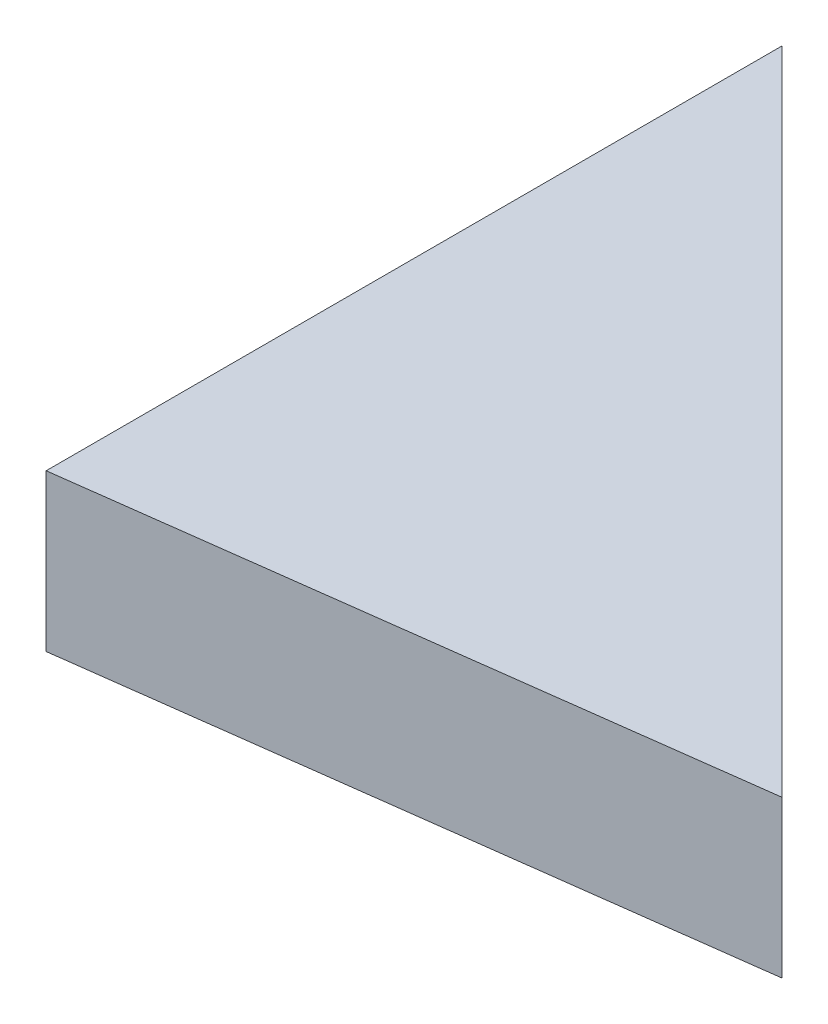
ISO-10303-21;
HEADER;
FILE_DESCRIPTION(('STEP AP214'),'2;1');
FILE_NAME('part.step','',(''),(''),'','','');
FILE_SCHEMA(('AUTOMOTIVE_DESIGN { 1 0 10303 214 1 1 1 1 }'));
ENDSEC;
DATA;
#1=APPLICATION_CONTEXT('core data for automotive mechanical design processes');
#2=APPLICATION_PROTOCOL_DEFINITION('international standard','automotive_design',2000,#1);
#3=PRODUCT_CONTEXT('',#1,'mechanical');
#4=PRODUCT('Part','Part','',(#3));
#5=PRODUCT_RELATED_PRODUCT_CATEGORY('part','',(#4));
#6=PRODUCT_DEFINITION_FORMATION('','',#4);
#7=PRODUCT_DEFINITION_CONTEXT('part definition',#1,'design');
#8=PRODUCT_DEFINITION('design','',#6,#7);
#9=PRODUCT_DEFINITION_SHAPE('','',#8);
#10=(LENGTH_UNIT() NAMED_UNIT(*) SI_UNIT(.MILLI.,.METRE.));
#11=(NAMED_UNIT(*) PLANE_ANGLE_UNIT() SI_UNIT($,.RADIAN.));
#12=(NAMED_UNIT(*) SI_UNIT($,.STERADIAN.) SOLID_ANGLE_UNIT());
#13=UNCERTAINTY_MEASURE_WITH_UNIT(LENGTH_MEASURE(1.E-05),#10,'distance_accuracy_value','');
#14=(GEOMETRIC_REPRESENTATION_CONTEXT(3) GLOBAL_UNCERTAINTY_ASSIGNED_CONTEXT((#13)) GLOBAL_UNIT_ASSIGNED_CONTEXT((#10,
#11,#12)) REPRESENTATION_CONTEXT('',''));
#15=CARTESIAN_POINT('',(0.,0.,0.));
#16=DIRECTION('',(0.,0.,1.));
#17=DIRECTION('',(1.,0.,0.));
#18=AXIS2_PLACEMENT_3D('',#15,#16,#17);
#19=CARTESIAN_POINT('',(52.4037824178887,3.175,0.));
#20=DIRECTION('',(1.,0.,0.));
#21=DIRECTION('',(0.,0.,-1.));
#22=AXIS2_PLACEMENT_3D('',#19,#20,#21);
#23=PLANE('',#22);
#24=DIRECTION('',(0.,0.,1.));
#25=VECTOR('',#24,1.);
#26=CARTESIAN_POINT('',(52.4037824178887,0.,0.));
#27=LINE('',#26,#25);
#28=CARTESIAN_POINT('',(52.4037824178887,0.,8.65426026672683));
#29=VERTEX_POINT('',#28);
#30=CARTESIAN_POINT('',(52.4037824178887,0.,23.5711999527268));
#31=VERTEX_POINT('',#30);
#32=EDGE_CURVE('E96',#29,#31,#27,.T.);
#33=ORIENTED_EDGE('',*,*,#32,.T.);
#34=DIRECTION('',(0.,-1.,0.));
#35=VECTOR('',#34,1.);
#36=CARTESIAN_POINT('',(52.4037824178887,3.175,23.5711999527268));
#37=LINE('',#36,#35);
#38=CARTESIAN_POINT('',(52.4037824178887,3.175,23.5711999527268));
#39=VERTEX_POINT('',#38);
#40=EDGE_CURVE('E11',#39,#31,#37,.T.);
#41=ORIENTED_EDGE('',*,*,#40,.F.);
#42=DIRECTION('',(0.,0.,1.));
#43=VECTOR('',#42,1.);
#44=CARTESIAN_POINT('',(52.4037824178887,3.175,0.));
#45=LINE('',#44,#43);
#46=CARTESIAN_POINT('',(52.4037824178887,3.175,8.65426026672683));
#47=VERTEX_POINT('',#46);
#48=EDGE_CURVE('E90',#47,#39,#45,.T.);
#49=ORIENTED_EDGE('',*,*,#48,.F.);
#50=DIRECTION('',(0.,-1.,0.));
#51=VECTOR('',#50,1.);
#52=CARTESIAN_POINT('',(52.4037824178887,3.175,8.65426026672683));
#53=LINE('',#52,#51);
#54=EDGE_CURVE('E64',#47,#29,#53,.T.);
#55=ORIENTED_EDGE('',*,*,#54,.T.);
#56=EDGE_LOOP('',(#33,#41,#49,#55));
#57=FACE_BOUND('',#56,.T.);
#58=ADVANCED_FACE('F47',(#57),#23,.F.);
#59=CARTESIAN_POINT('',(3.91463859582438,3.175,29.9161774819805));
#60=DIRECTION('',(-0.129747473069321,0.,-0.991547070608413));
#61=DIRECTION('',(-0.991547070608413,0.,0.129747473069321));
#62=AXIS2_PLACEMENT_3D('',#59,#60,#61);
#63=PLANE('',#62);
#64=DIRECTION('',(0.991547070608413,0.,-0.129747473069321));
#65=VECTOR('',#64,1.);
#66=CARTESIAN_POINT('',(3.91463859582438,0.,29.9161774819805));
#67=LINE('',#66,#65);
#68=CARTESIAN_POINT('',(65.5946500016934,0.,21.8451278505315));
#69=VERTEX_POINT('',#68);
#70=EDGE_CURVE('E100',#31,#69,#67,.T.);
#71=ORIENTED_EDGE('',*,*,#70,.T.);
#72=DIRECTION('',(0.,-1.,0.));
#73=VECTOR('',#72,1.);
#74=CARTESIAN_POINT('',(65.5946500016934,3.175,21.8451278505315));
#75=LINE('',#74,#73);
#76=CARTESIAN_POINT('',(65.5946500016934,3.175,21.8451278505315));
#77=VERTEX_POINT('',#76);
#78=EDGE_CURVE('E56',#77,#69,#75,.T.);
#79=ORIENTED_EDGE('',*,*,#78,.F.);
#80=DIRECTION('',(0.991547070608413,0.,-0.129747473069321));
#81=VECTOR('',#80,1.);
#82=CARTESIAN_POINT('',(3.91463859582438,3.175,29.9161774819805));
#83=LINE('',#82,#81);
#84=EDGE_CURVE('E82',#39,#77,#83,.T.);
#85=ORIENTED_EDGE('',*,*,#84,.F.);
#86=ORIENTED_EDGE('',*,*,#40,.T.);
#87=EDGE_LOOP('',(#71,#79,#85,#86));
#88=FACE_BOUND('',#87,.T.);
#89=ADVANCED_FACE('F84',(#88),#63,.F.);
#90=CARTESIAN_POINT('',(21.8747610755808,3.175,-21.8747610755809));
#91=DIRECTION('',(0.707106781186546,0.,-0.707106781186549));
#92=DIRECTION('',(-0.707106781186549,0.,-0.707106781186546));
#93=AXIS2_PLACEMENT_3D('',#90,#91,#92);
#94=PLANE('',#93);
#95=DIRECTION('',(0.707106781186549,0.,0.707106781186546));
#96=VECTOR('',#95,1.);
#97=CARTESIAN_POINT('',(21.8747610755808,0.,-21.8747610755809));
#98=LINE('',#97,#96);
#99=EDGE_CURVE('E94',#29,#69,#98,.T.);
#100=ORIENTED_EDGE('',*,*,#99,.F.);
#101=ORIENTED_EDGE('',*,*,#54,.F.);
#102=DIRECTION('',(0.707106781186549,0.,0.707106781186546));
#103=VECTOR('',#102,1.);
#104=CARTESIAN_POINT('',(21.8747610755808,3.175,-21.8747610755809));
#105=LINE('',#104,#103);
#106=EDGE_CURVE('E89',#47,#77,#105,.T.);
#107=ORIENTED_EDGE('',*,*,#106,.T.);
#108=ORIENTED_EDGE('',*,*,#78,.T.);
#109=EDGE_LOOP('',(#100,#101,#107,#108));
#110=FACE_BOUND('',#109,.T.);
#111=ADVANCED_FACE('F111',(#110),#94,.T.);
#112=CARTESIAN_POINT('',(0.,3.175,0.));
#113=DIRECTION('',(0.,1.,0.));
#114=DIRECTION('',(0.,0.,1.));
#115=AXIS2_PLACEMENT_3D('',#112,#113,#114);
#116=PLANE('',#115);
#117=ORIENTED_EDGE('',*,*,#48,.T.);
#118=ORIENTED_EDGE('',*,*,#84,.T.);
#119=ORIENTED_EDGE('',*,*,#106,.F.);
#120=EDGE_LOOP('',(#117,#118,#119));
#121=FACE_BOUND('',#120,.T.);
#122=ADVANCED_FACE('F92',(#121),#116,.T.);
#123=CARTESIAN_POINT('',(0.,0.,0.));
#124=DIRECTION('',(0.,1.,0.));
#125=DIRECTION('',(0.,0.,1.));
#126=AXIS2_PLACEMENT_3D('',#123,#124,#125);
#127=PLANE('',#126);
#128=ORIENTED_EDGE('',*,*,#32,.F.);
#129=ORIENTED_EDGE('',*,*,#99,.T.);
#130=ORIENTED_EDGE('',*,*,#70,.F.);
#131=EDGE_LOOP('',(#128,#129,#130));
#132=FACE_BOUND('',#131,.T.);
#133=ADVANCED_FACE('F118',(#132),#127,.F.);
#134=CLOSED_SHELL('',(#58,#89,#111,#122,#133));
#135=MANIFOLD_SOLID_BREP('B2',#134);
#136=ADVANCED_BREP_SHAPE_REPRESENTATION('',(#18,#135),#14);
#137=SHAPE_DEFINITION_REPRESENTATION(#9,#136);
ENDSEC;
END-ISO-10303-21;
